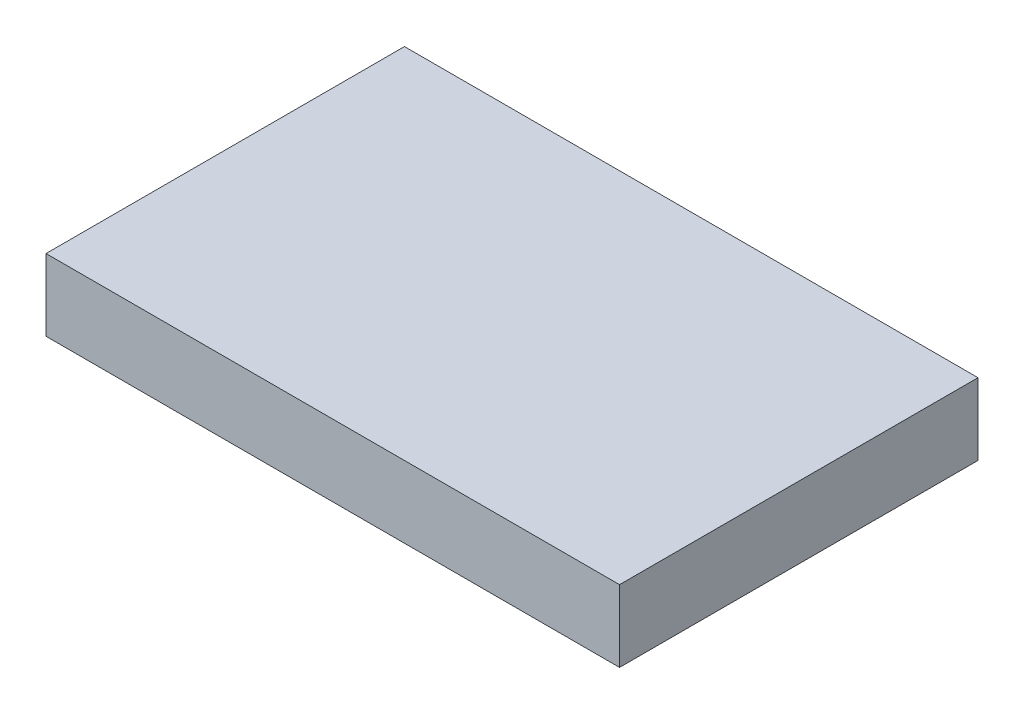
ISO-10303-21;
HEADER;
FILE_DESCRIPTION(('STEP AP214'),'2;1');
FILE_NAME('part.step','',(''),(''),'','','');
FILE_SCHEMA(('AUTOMOTIVE_DESIGN { 1 0 10303 214 1 1 1 1 }'));
ENDSEC;
DATA;
#1=APPLICATION_CONTEXT('core data for automotive mechanical design processes');
#2=APPLICATION_PROTOCOL_DEFINITION('international standard','automotive_design',2000,#1);
#3=PRODUCT_CONTEXT('',#1,'mechanical');
#4=PRODUCT('Part','Part','',(#3));
#5=PRODUCT_RELATED_PRODUCT_CATEGORY('part','',(#4));
#6=PRODUCT_DEFINITION_FORMATION('','',#4);
#7=PRODUCT_DEFINITION_CONTEXT('part definition',#1,'design');
#8=PRODUCT_DEFINITION('design','',#6,#7);
#9=PRODUCT_DEFINITION_SHAPE('','',#8);
#10=(LENGTH_UNIT() NAMED_UNIT(*) SI_UNIT(.MILLI.,.METRE.));
#11=(NAMED_UNIT(*) PLANE_ANGLE_UNIT() SI_UNIT($,.RADIAN.));
#12=(NAMED_UNIT(*) SI_UNIT($,.STERADIAN.) SOLID_ANGLE_UNIT());
#13=UNCERTAINTY_MEASURE_WITH_UNIT(LENGTH_MEASURE(1.E-05),#10,'distance_accuracy_value','');
#14=(GEOMETRIC_REPRESENTATION_CONTEXT(3) GLOBAL_UNCERTAINTY_ASSIGNED_CONTEXT((#13)) GLOBAL_UNIT_ASSIGNED_CONTEXT((#10,
#11,#12)) REPRESENTATION_CONTEXT('',''));
#15=CARTESIAN_POINT('',(0.,0.,0.));
#16=DIRECTION('',(0.,0.,1.));
#17=DIRECTION('',(1.,0.,0.));
#18=AXIS2_PLACEMENT_3D('',#15,#16,#17);
#19=CARTESIAN_POINT('',(6.86746987951808,5.,-18.7048192771084));
#20=DIRECTION('',(-1.,0.,0.));
#21=DIRECTION('',(0.,0.,1.));
#22=AXIS2_PLACEMENT_3D('',#19,#20,#21);
#23=PLANE('',#22);
#24=DIRECTION('',(0.,0.,-1.));
#25=VECTOR('',#24,1.);
#26=CARTESIAN_POINT('',(6.86746987951808,0.,-18.7048192771084));
#27=LINE('',#26,#25);
#28=CARTESIAN_POINT('',(6.86746987951808,0.,6.29518072289157));
#29=VERTEX_POINT('',#28);
#30=CARTESIAN_POINT('',(6.86746987951808,0.,-18.7048192771084));
#31=VERTEX_POINT('',#30);
#32=EDGE_CURVE('E107',#29,#31,#27,.T.);
#33=ORIENTED_EDGE('',*,*,#32,.T.);
#34=DIRECTION('',(0.,-1.,0.));
#35=VECTOR('',#34,1.);
#36=CARTESIAN_POINT('',(6.86746987951808,5.,-18.7048192771084));
#37=LINE('',#36,#35);
#38=CARTESIAN_POINT('',(6.86746987951808,5.,-18.7048192771084));
#39=VERTEX_POINT('',#38);
#40=EDGE_CURVE('E11',#39,#31,#37,.T.);
#41=ORIENTED_EDGE('',*,*,#40,.F.);
#42=DIRECTION('',(0.,0.,-1.));
#43=VECTOR('',#42,1.);
#44=CARTESIAN_POINT('',(6.86746987951808,5.,-18.7048192771084));
#45=LINE('',#44,#43);
#46=CARTESIAN_POINT('',(6.86746987951808,5.,6.29518072289157));
#47=VERTEX_POINT('',#46);
#48=EDGE_CURVE('E91',#47,#39,#45,.T.);
#49=ORIENTED_EDGE('',*,*,#48,.F.);
#50=DIRECTION('',(0.,-1.,0.));
#51=VECTOR('',#50,1.);
#52=CARTESIAN_POINT('',(6.86746987951808,5.,6.29518072289157));
#53=LINE('',#52,#51);
#54=EDGE_CURVE('E103',#47,#29,#53,.T.);
#55=ORIENTED_EDGE('',*,*,#54,.T.);
#56=EDGE_LOOP('',(#33,#41,#49,#55));
#57=FACE_BOUND('',#56,.T.);
#58=ADVANCED_FACE('F39',(#57),#23,.F.);
#59=CARTESIAN_POINT('',(-33.1325301204819,5.,-18.7048192771084));
#60=DIRECTION('',(0.,0.,1.));
#61=DIRECTION('',(1.,0.,0.));
#62=AXIS2_PLACEMENT_3D('',#59,#60,#61);
#63=PLANE('',#62);
#64=DIRECTION('',(-1.,0.,0.));
#65=VECTOR('',#64,1.);
#66=CARTESIAN_POINT('',(-33.1325301204819,0.,-18.7048192771084));
#67=LINE('',#66,#65);
#68=CARTESIAN_POINT('',(-33.1325301204819,0.,-18.7048192771084));
#69=VERTEX_POINT('',#68);
#70=EDGE_CURVE('E96',#31,#69,#67,.T.);
#71=ORIENTED_EDGE('',*,*,#70,.T.);
#72=DIRECTION('',(0.,-1.,0.));
#73=VECTOR('',#72,1.);
#74=CARTESIAN_POINT('',(-33.1325301204819,5.,-18.7048192771084));
#75=LINE('',#74,#73);
#76=CARTESIAN_POINT('',(-33.1325301204819,5.,-18.7048192771084));
#77=VERTEX_POINT('',#76);
#78=EDGE_CURVE('E48',#77,#69,#75,.T.);
#79=ORIENTED_EDGE('',*,*,#78,.F.);
#80=DIRECTION('',(-1.,0.,0.));
#81=VECTOR('',#80,1.);
#82=CARTESIAN_POINT('',(-33.1325301204819,5.,-18.7048192771084));
#83=LINE('',#82,#81);
#84=EDGE_CURVE('E86',#39,#77,#83,.T.);
#85=ORIENTED_EDGE('',*,*,#84,.F.);
#86=ORIENTED_EDGE('',*,*,#40,.T.);
#87=EDGE_LOOP('',(#71,#79,#85,#86));
#88=FACE_BOUND('',#87,.T.);
#89=ADVANCED_FACE('F95',(#88),#63,.F.);
#90=CARTESIAN_POINT('',(-33.1325301204819,5.,-18.7048192771084));
#91=DIRECTION('',(1.,0.,0.));
#92=DIRECTION('',(0.,0.,-1.));
#93=AXIS2_PLACEMENT_3D('',#90,#91,#92);
#94=PLANE('',#93);
#95=DIRECTION('',(0.,0.,1.));
#96=VECTOR('',#95,1.);
#97=CARTESIAN_POINT('',(-33.1325301204819,0.,-18.7048192771084));
#98=LINE('',#97,#96);
#99=CARTESIAN_POINT('',(-33.1325301204819,0.,6.29518072289157));
#100=VERTEX_POINT('',#99);
#101=EDGE_CURVE('E73',#69,#100,#98,.T.);
#102=ORIENTED_EDGE('',*,*,#101,.T.);
#103=DIRECTION('',(0.,-1.,0.));
#104=VECTOR('',#103,1.);
#105=CARTESIAN_POINT('',(-33.1325301204819,5.,6.29518072289157));
#106=LINE('',#105,#104);
#107=CARTESIAN_POINT('',(-33.1325301204819,5.,6.29518072289157));
#108=VERTEX_POINT('',#107);
#109=EDGE_CURVE('E98',#108,#100,#106,.T.);
#110=ORIENTED_EDGE('',*,*,#109,.F.);
#111=DIRECTION('',(0.,0.,1.));
#112=VECTOR('',#111,1.);
#113=CARTESIAN_POINT('',(-33.1325301204819,5.,-18.7048192771084));
#114=LINE('',#113,#112);
#115=EDGE_CURVE('E89',#77,#108,#114,.T.);
#116=ORIENTED_EDGE('',*,*,#115,.F.);
#117=ORIENTED_EDGE('',*,*,#78,.T.);
#118=EDGE_LOOP('',(#102,#110,#116,#117));
#119=FACE_BOUND('',#118,.T.);
#120=ADVANCED_FACE('F99',(#119),#94,.F.);
#121=CARTESIAN_POINT('',(-33.1325301204819,5.,6.29518072289157));
#122=DIRECTION('',(0.,0.,-1.));
#123=DIRECTION('',(-1.,0.,0.));
#124=AXIS2_PLACEMENT_3D('',#121,#122,#123);
#125=PLANE('',#124);
#126=DIRECTION('',(1.,0.,0.));
#127=VECTOR('',#126,1.);
#128=CARTESIAN_POINT('',(-33.1325301204819,0.,6.29518072289157));
#129=LINE('',#128,#127);
#130=EDGE_CURVE('E79',#100,#29,#129,.T.);
#131=ORIENTED_EDGE('',*,*,#130,.T.);
#132=ORIENTED_EDGE('',*,*,#54,.F.);
#133=DIRECTION('',(1.,0.,0.));
#134=VECTOR('',#133,1.);
#135=CARTESIAN_POINT('',(-33.1325301204819,5.,6.29518072289157));
#136=LINE('',#135,#134);
#137=EDGE_CURVE('E56',#108,#47,#136,.T.);
#138=ORIENTED_EDGE('',*,*,#137,.F.);
#139=ORIENTED_EDGE('',*,*,#109,.T.);
#140=EDGE_LOOP('',(#131,#132,#138,#139));
#141=FACE_BOUND('',#140,.T.);
#142=ADVANCED_FACE('F120',(#141),#125,.F.);
#143=CARTESIAN_POINT('',(0.,5.,0.));
#144=DIRECTION('',(0.,1.,0.));
#145=DIRECTION('',(0.,0.,1.));
#146=AXIS2_PLACEMENT_3D('',#143,#144,#145);
#147=PLANE('',#146);
#148=ORIENTED_EDGE('',*,*,#48,.T.);
#149=ORIENTED_EDGE('',*,*,#84,.T.);
#150=ORIENTED_EDGE('',*,*,#115,.T.);
#151=ORIENTED_EDGE('',*,*,#137,.T.);
#152=EDGE_LOOP('',(#148,#149,#150,#151));
#153=FACE_BOUND('',#152,.T.);
#154=ADVANCED_FACE('F87',(#153),#147,.T.);
#155=CARTESIAN_POINT('',(0.,0.,0.));
#156=DIRECTION('',(0.,1.,0.));
#157=DIRECTION('',(0.,0.,1.));
#158=AXIS2_PLACEMENT_3D('',#155,#156,#157);
#159=PLANE('',#158);
#160=ORIENTED_EDGE('',*,*,#32,.F.);
#161=ORIENTED_EDGE('',*,*,#130,.F.);
#162=ORIENTED_EDGE('',*,*,#101,.F.);
#163=ORIENTED_EDGE('',*,*,#70,.F.);
#164=EDGE_LOOP('',(#160,#161,#162,#163));
#165=FACE_BOUND('',#164,.T.);
#166=ADVANCED_FACE('F123',(#165),#159,.F.);
#167=CLOSED_SHELL('',(#58,#89,#120,#142,#154,#166));
#168=MANIFOLD_SOLID_BREP('B2',#167);
#169=ADVANCED_BREP_SHAPE_REPRESENTATION('',(#18,#168),#14);
#170=SHAPE_DEFINITION_REPRESENTATION(#9,#169);
ENDSEC;
END-ISO-10303-21;
